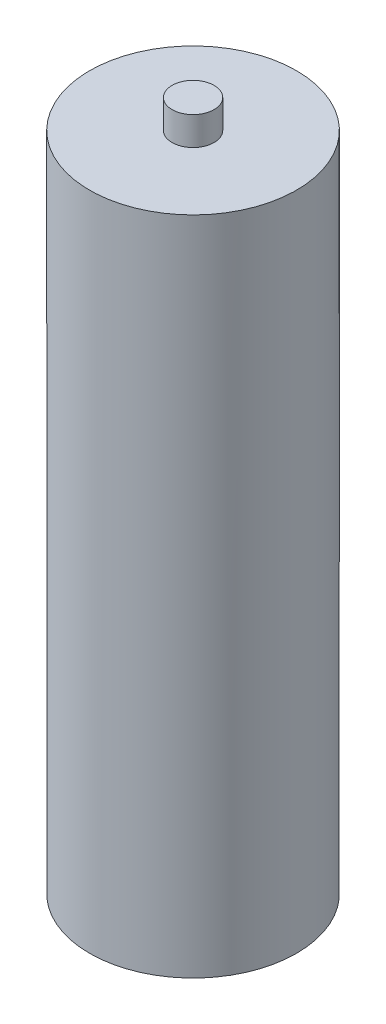
ISO-10303-21;
HEADER;
FILE_DESCRIPTION(('STEP AP214'),'2;1');
FILE_NAME('part.step','',(''),(''),'','','');
FILE_SCHEMA(('AUTOMOTIVE_DESIGN { 1 0 10303 214 1 1 1 1 }'));
ENDSEC;
DATA;
#1=APPLICATION_CONTEXT('core data for automotive mechanical design processes');
#2=APPLICATION_PROTOCOL_DEFINITION('international standard','automotive_design',2000,#1);
#3=PRODUCT_CONTEXT('',#1,'mechanical');
#4=PRODUCT('Part','Part','',(#3));
#5=PRODUCT_RELATED_PRODUCT_CATEGORY('part','',(#4));
#6=PRODUCT_DEFINITION_FORMATION('','',#4);
#7=PRODUCT_DEFINITION_CONTEXT('part definition',#1,'design');
#8=PRODUCT_DEFINITION('design','',#6,#7);
#9=PRODUCT_DEFINITION_SHAPE('','',#8);
#10=(LENGTH_UNIT() NAMED_UNIT(*) SI_UNIT(.MILLI.,.METRE.));
#11=(NAMED_UNIT(*) PLANE_ANGLE_UNIT() SI_UNIT($,.RADIAN.));
#12=(NAMED_UNIT(*) SI_UNIT($,.STERADIAN.) SOLID_ANGLE_UNIT());
#13=UNCERTAINTY_MEASURE_WITH_UNIT(LENGTH_MEASURE(1.E-05),#10,'distance_accuracy_value','');
#14=(GEOMETRIC_REPRESENTATION_CONTEXT(3) GLOBAL_UNCERTAINTY_ASSIGNED_CONTEXT((#13)) GLOBAL_UNIT_ASSIGNED_CONTEXT((#10,
#11,#12)) REPRESENTATION_CONTEXT('',''));
#15=CARTESIAN_POINT('',(0.,0.,0.));
#16=DIRECTION('',(0.,0.,1.));
#17=DIRECTION('',(1.,0.,0.));
#18=AXIS2_PLACEMENT_3D('',#15,#16,#17);
#19=CARTESIAN_POINT('',(0.,46.,0.));
#20=DIRECTION('',(0.,-1.,0.));
#21=DIRECTION('',(0.,0.,-1.));
#22=AXIS2_PLACEMENT_3D('',#19,#20,#21);
#23=CYLINDRICAL_SURFACE('',#22,7.25);
#24=CARTESIAN_POINT('',(0.,0.,0.));
#25=DIRECTION('',(0.,1.,0.));
#26=DIRECTION('',(0.,0.,1.));
#27=AXIS2_PLACEMENT_3D('',#24,#25,#26);
#28=CIRCLE('',#27,7.25);
#29=CARTESIAN_POINT('',(0.,0.,7.25));
#30=VERTEX_POINT('',#29);
#31=EDGE_CURVE('E54',#30,#30,#28,.T.);
#32=ORIENTED_EDGE('',*,*,#31,.T.);
#33=EDGE_LOOP('',(#32));
#34=FACE_BOUND('',#33,.T.);
#35=CARTESIAN_POINT('',(0.,46.3,0.));
#36=DIRECTION('',(0.,-1.,0.));
#37=DIRECTION('',(0.,0.,-1.));
#38=AXIS2_PLACEMENT_3D('',#35,#36,#37);
#39=CIRCLE('',#38,7.25);
#40=CARTESIAN_POINT('',(0.,46.3,-7.25));
#41=VERTEX_POINT('',#40);
#42=EDGE_CURVE('E64',#41,#41,#39,.T.);
#43=ORIENTED_EDGE('',*,*,#42,.T.);
#44=EDGE_LOOP('',(#43));
#45=FACE_BOUND('',#44,.T.);
#46=ADVANCED_FACE('F51',(#34,#45),#23,.T.);
#47=CARTESIAN_POINT('',(0.,0.,0.));
#48=DIRECTION('',(0.,1.,0.));
#49=DIRECTION('',(0.,0.,1.));
#50=AXIS2_PLACEMENT_3D('',#47,#48,#49);
#51=PLANE('',#50);
#52=ORIENTED_EDGE('',*,*,#31,.F.);
#53=EDGE_LOOP('',(#52));
#54=FACE_BOUND('',#53,.T.);
#55=ADVANCED_FACE('F86',(#54),#51,.F.);
#56=CARTESIAN_POINT('',(0.,46.3,0.));
#57=DIRECTION('',(0.,-1.,0.));
#58=DIRECTION('',(0.,0.,-1.));
#59=AXIS2_PLACEMENT_3D('',#56,#57,#58);
#60=PLANE('',#59);
#61=CARTESIAN_POINT('',(0.,46.3,0.));
#62=DIRECTION('',(0.,1.,0.));
#63=DIRECTION('',(0.,0.,1.));
#64=AXIS2_PLACEMENT_3D('',#61,#62,#63);
#65=CIRCLE('',#64,1.47131634498565);
#66=CARTESIAN_POINT('',(0.,46.3,1.47131634498565));
#67=VERTEX_POINT('',#66);
#68=EDGE_CURVE('E12',#67,#67,#65,.T.);
#69=ORIENTED_EDGE('',*,*,#68,.F.);
#70=EDGE_LOOP('',(#69));
#71=FACE_BOUND('',#70,.T.);
#72=ORIENTED_EDGE('',*,*,#42,.F.);
#73=EDGE_LOOP('',(#72));
#74=FACE_BOUND('',#73,.T.);
#75=ADVANCED_FACE('F79',(#71,#74),#60,.F.);
#76=CARTESIAN_POINT('',(0.,48.3,0.));
#77=DIRECTION('',(0.,-1.,0.));
#78=DIRECTION('',(0.,0.,-1.));
#79=AXIS2_PLACEMENT_3D('',#76,#77,#78);
#80=CYLINDRICAL_SURFACE('',#79,1.47131634498565);
#81=CARTESIAN_POINT('',(0.,48.3,0.));
#82=DIRECTION('',(0.,1.,0.));
#83=DIRECTION('',(0.,0.,1.));
#84=AXIS2_PLACEMENT_3D('',#81,#82,#83);
#85=CIRCLE('',#84,1.47131634498565);
#86=CARTESIAN_POINT('',(0.,48.3,1.47131634498565));
#87=VERTEX_POINT('',#86);
#88=EDGE_CURVE('E66',#87,#87,#85,.T.);
#89=ORIENTED_EDGE('',*,*,#88,.F.);
#90=EDGE_LOOP('',(#89));
#91=FACE_BOUND('',#90,.T.);
#92=ORIENTED_EDGE('',*,*,#68,.T.);
#93=EDGE_LOOP('',(#92));
#94=FACE_BOUND('',#93,.T.);
#95=ADVANCED_FACE('F77',(#91,#94),#80,.T.);
#96=CARTESIAN_POINT('',(0.,48.3,0.));
#97=DIRECTION('',(0.,1.,0.));
#98=DIRECTION('',(0.,0.,1.));
#99=AXIS2_PLACEMENT_3D('',#96,#97,#98);
#100=PLANE('',#99);
#101=ORIENTED_EDGE('',*,*,#88,.T.);
#102=EDGE_LOOP('',(#101));
#103=FACE_BOUND('',#102,.T.);
#104=ADVANCED_FACE('F75',(#103),#100,.T.);
#105=CLOSED_SHELL('',(#46,#55,#75,#95,#104));
#106=MANIFOLD_SOLID_BREP('B2',#105);
#107=ADVANCED_BREP_SHAPE_REPRESENTATION('',(#18,#106),#14);
#108=SHAPE_DEFINITION_REPRESENTATION(#9,#107);
ENDSEC;
END-ISO-10303-21;
